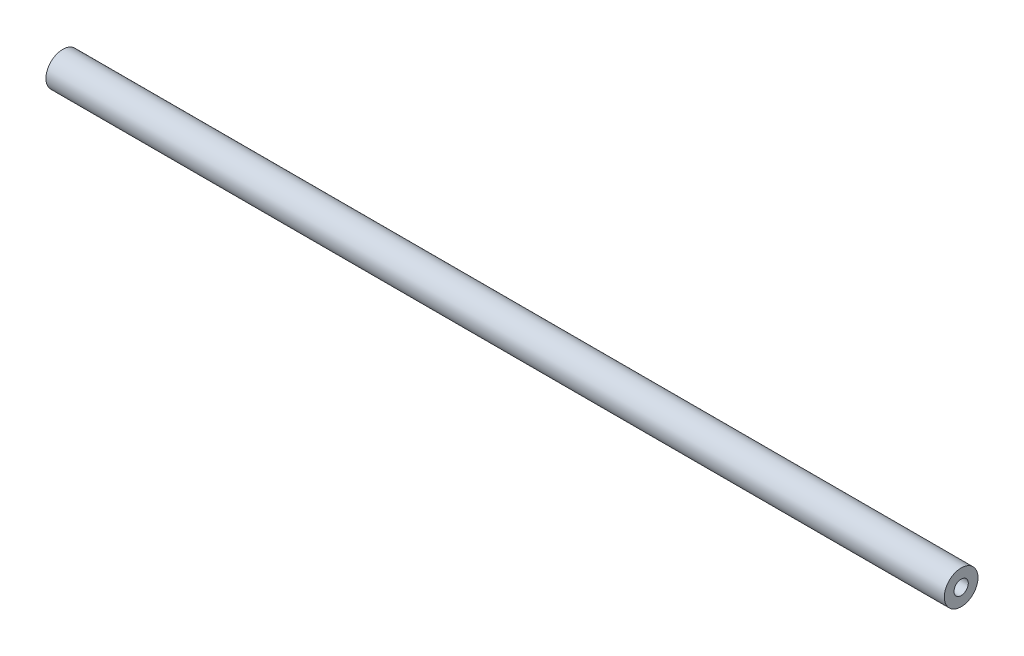
ISO-10303-21;
HEADER;
FILE_DESCRIPTION(('STEP AP214'),'2;1');
FILE_NAME('part.step','',(''),(''),'','','');
FILE_SCHEMA(('AUTOMOTIVE_DESIGN { 1 0 10303 214 1 1 1 1 }'));
ENDSEC;
DATA;
#1=APPLICATION_CONTEXT('core data for automotive mechanical design processes');
#2=APPLICATION_PROTOCOL_DEFINITION('international standard','automotive_design',2000,#1);
#3=PRODUCT_CONTEXT('',#1,'mechanical');
#4=PRODUCT('Part','Part','',(#3));
#5=PRODUCT_RELATED_PRODUCT_CATEGORY('part','',(#4));
#6=PRODUCT_DEFINITION_FORMATION('','',#4);
#7=PRODUCT_DEFINITION_CONTEXT('part definition',#1,'design');
#8=PRODUCT_DEFINITION('design','',#6,#7);
#9=PRODUCT_DEFINITION_SHAPE('','',#8);
#10=(LENGTH_UNIT() NAMED_UNIT(*) SI_UNIT(.MILLI.,.METRE.));
#11=(NAMED_UNIT(*) PLANE_ANGLE_UNIT() SI_UNIT($,.RADIAN.));
#12=(NAMED_UNIT(*) SI_UNIT($,.STERADIAN.) SOLID_ANGLE_UNIT());
#13=UNCERTAINTY_MEASURE_WITH_UNIT(LENGTH_MEASURE(1.E-05),#10,'distance_accuracy_value','');
#14=(GEOMETRIC_REPRESENTATION_CONTEXT(3) GLOBAL_UNCERTAINTY_ASSIGNED_CONTEXT((#13)) GLOBAL_UNIT_ASSIGNED_CONTEXT((#10,
#11,#12)) REPRESENTATION_CONTEXT('',''));
#15=CARTESIAN_POINT('',(0.,0.,0.));
#16=DIRECTION('',(0.,0.,1.));
#17=DIRECTION('',(1.,0.,0.));
#18=AXIS2_PLACEMENT_3D('',#15,#16,#17);
#19=CARTESIAN_POINT('',(127.,0.,0.));
#20=DIRECTION('',(-1.,0.,0.));
#21=DIRECTION('',(0.,0.,1.));
#22=AXIS2_PLACEMENT_3D('',#19,#20,#21);
#23=CYLINDRICAL_SURFACE('',#22,4.7625);
#24=CARTESIAN_POINT('',(127.,0.,0.));
#25=DIRECTION('',(1.,0.,0.));
#26=DIRECTION('',(0.,0.,-1.));
#27=AXIS2_PLACEMENT_3D('',#24,#25,#26);
#28=CIRCLE('',#27,4.7625);
#29=CARTESIAN_POINT('',(127.,0.,-4.7625));
#30=VERTEX_POINT('',#29);
#31=EDGE_CURVE('E11',#30,#30,#28,.T.);
#32=ORIENTED_EDGE('',*,*,#31,.F.);
#33=EDGE_LOOP('',(#32));
#34=FACE_BOUND('',#33,.T.);
#35=CARTESIAN_POINT('',(-127.,0.,0.));
#36=DIRECTION('',(1.,0.,0.));
#37=DIRECTION('',(0.,0.,-1.));
#38=AXIS2_PLACEMENT_3D('',#35,#36,#37);
#39=CIRCLE('',#38,4.7625);
#40=CARTESIAN_POINT('',(-127.,0.,-4.7625));
#41=VERTEX_POINT('',#40);
#42=EDGE_CURVE('E46',#41,#41,#39,.T.);
#43=ORIENTED_EDGE('',*,*,#42,.T.);
#44=EDGE_LOOP('',(#43));
#45=FACE_BOUND('',#44,.T.);
#46=ADVANCED_FACE('F43',(#34,#45),#23,.T.);
#47=CARTESIAN_POINT('',(127.,0.,0.));
#48=DIRECTION('',(1.,0.,0.));
#49=DIRECTION('',(0.,0.,-1.));
#50=AXIS2_PLACEMENT_3D('',#47,#48,#49);
#51=PLANE('',#50);
#52=CARTESIAN_POINT('',(127.,0.,0.));
#53=DIRECTION('',(1.,0.,0.));
#54=DIRECTION('',(0.,0.,-1.));
#55=AXIS2_PLACEMENT_3D('',#52,#53,#54);
#56=CIRCLE('',#55,2.01929999999999);
#57=CARTESIAN_POINT('',(127.,0.,-2.01929999999999));
#58=VERTEX_POINT('',#57);
#59=EDGE_CURVE('E67',#58,#58,#56,.T.);
#60=ORIENTED_EDGE('',*,*,#59,.F.);
#61=EDGE_LOOP('',(#60));
#62=FACE_BOUND('',#61,.T.);
#63=ORIENTED_EDGE('',*,*,#31,.T.);
#64=EDGE_LOOP('',(#63));
#65=FACE_BOUND('',#64,.T.);
#66=ADVANCED_FACE('F85',(#62,#65),#51,.T.);
#67=CARTESIAN_POINT('',(-127.,0.,0.));
#68=DIRECTION('',(1.,0.,0.));
#69=DIRECTION('',(0.,0.,-1.));
#70=AXIS2_PLACEMENT_3D('',#67,#68,#69);
#71=PLANE('',#70);
#72=CARTESIAN_POINT('',(-127.,0.,0.));
#73=DIRECTION('',(-1.,0.,0.));
#74=DIRECTION('',(0.,0.,1.));
#75=AXIS2_PLACEMENT_3D('',#72,#73,#74);
#76=CIRCLE('',#75,2.01929999999999);
#77=CARTESIAN_POINT('',(-127.,0.,2.01929999999999));
#78=VERTEX_POINT('',#77);
#79=EDGE_CURVE('E66',#78,#78,#76,.T.);
#80=ORIENTED_EDGE('',*,*,#79,.F.);
#81=EDGE_LOOP('',(#80));
#82=FACE_BOUND('',#81,.T.);
#83=ORIENTED_EDGE('',*,*,#42,.F.);
#84=EDGE_LOOP('',(#83));
#85=FACE_BOUND('',#84,.T.);
#86=ADVANCED_FACE('F82',(#82,#85),#71,.F.);
#87=CARTESIAN_POINT('',(-114.97056,0.,0.));
#88=DIRECTION('',(-1.,0.,0.));
#89=DIRECTION('',(0.,0.,1.));
#90=AXIS2_PLACEMENT_3D('',#87,#88,#89);
#91=CONICAL_SURFACE('',#90,2.0193,1.02974425867665);
#92=CARTESIAN_POINT('',(-113.757242151998,0.,0.));
#93=VERTEX_POINT('',#92);
#94=VERTEX_LOOP('',#93);
#95=FACE_BOUND('',#94,.T.);
#96=CARTESIAN_POINT('',(-114.97056,0.,0.));
#97=DIRECTION('',(-1.,0.,0.));
#98=DIRECTION('',(0.,0.,1.));
#99=AXIS2_PLACEMENT_3D('',#96,#97,#98);
#100=CIRCLE('',#99,2.0193);
#101=CARTESIAN_POINT('',(-114.97056,0.,2.0193));
#102=VERTEX_POINT('',#101);
#103=EDGE_CURVE('E70',#102,#102,#100,.T.);
#104=ORIENTED_EDGE('',*,*,#103,.T.);
#105=EDGE_LOOP('',(#104));
#106=FACE_BOUND('',#105,.T.);
#107=ADVANCED_FACE('F84',(#95,#106),#91,.F.);
#108=CARTESIAN_POINT('',(-127.,0.,0.));
#109=DIRECTION('',(-1.,0.,0.));
#110=DIRECTION('',(0.,0.,1.));
#111=AXIS2_PLACEMENT_3D('',#108,#109,#110);
#112=CYLINDRICAL_SURFACE('',#111,2.01929999999999);
#113=ORIENTED_EDGE('',*,*,#103,.F.);
#114=EDGE_LOOP('',(#113));
#115=FACE_BOUND('',#114,.T.);
#116=ORIENTED_EDGE('',*,*,#79,.T.);
#117=EDGE_LOOP('',(#116));
#118=FACE_BOUND('',#117,.T.);
#119=ADVANCED_FACE('F60',(#115,#118),#112,.F.);
#120=CARTESIAN_POINT('',(114.97056,0.,0.));
#121=DIRECTION('',(1.,0.,0.));
#122=DIRECTION('',(0.,0.,-1.));
#123=AXIS2_PLACEMENT_3D('',#120,#121,#122);
#124=CONICAL_SURFACE('',#123,2.0193,1.02974425867665);
#125=CARTESIAN_POINT('',(113.757242151998,0.,0.));
#126=VERTEX_POINT('',#125);
#127=VERTEX_LOOP('',#126);
#128=FACE_BOUND('',#127,.T.);
#129=CARTESIAN_POINT('',(114.97056,0.,0.));
#130=DIRECTION('',(1.,0.,0.));
#131=DIRECTION('',(0.,0.,-1.));
#132=AXIS2_PLACEMENT_3D('',#129,#130,#131);
#133=CIRCLE('',#132,2.0193);
#134=CARTESIAN_POINT('',(114.97056,0.,-2.0193));
#135=VERTEX_POINT('',#134);
#136=EDGE_CURVE('E64',#135,#135,#133,.T.);
#137=ORIENTED_EDGE('',*,*,#136,.T.);
#138=EDGE_LOOP('',(#137));
#139=FACE_BOUND('',#138,.T.);
#140=ADVANCED_FACE('F56',(#128,#139),#124,.F.);
#141=CARTESIAN_POINT('',(127.,0.,0.));
#142=DIRECTION('',(1.,0.,0.));
#143=DIRECTION('',(0.,0.,-1.));
#144=AXIS2_PLACEMENT_3D('',#141,#142,#143);
#145=CYLINDRICAL_SURFACE('',#144,2.01929999999999);
#146=ORIENTED_EDGE('',*,*,#136,.F.);
#147=EDGE_LOOP('',(#146));
#148=FACE_BOUND('',#147,.T.);
#149=ORIENTED_EDGE('',*,*,#59,.T.);
#150=EDGE_LOOP('',(#149));
#151=FACE_BOUND('',#150,.T.);
#152=ADVANCED_FACE('F59',(#148,#151),#145,.F.);
#153=CLOSED_SHELL('',(#46,#66,#86,#107,#119,#140,#152));
#154=MANIFOLD_SOLID_BREP('B2',#153);
#155=ADVANCED_BREP_SHAPE_REPRESENTATION('',(#18,#154),#14);
#156=SHAPE_DEFINITION_REPRESENTATION(#9,#155);
ENDSEC;
END-ISO-10303-21;
